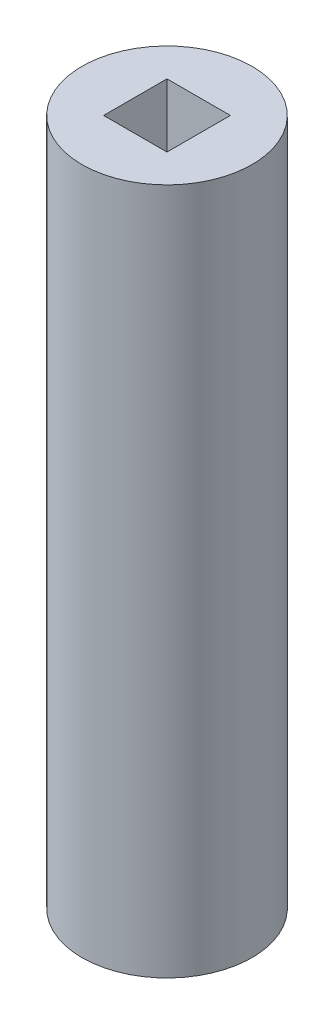
ISO-10303-21;
HEADER;
FILE_DESCRIPTION(('STEP AP214'),'2;1');
FILE_NAME('part.step','',(''),(''),'','','');
FILE_SCHEMA(('AUTOMOTIVE_DESIGN { 1 0 10303 214 1 1 1 1 }'));
ENDSEC;
DATA;
#1=APPLICATION_CONTEXT('core data for automotive mechanical design processes');
#2=APPLICATION_PROTOCOL_DEFINITION('international standard','automotive_design',2000,#1);
#3=PRODUCT_CONTEXT('',#1,'mechanical');
#4=PRODUCT('Part','Part','',(#3));
#5=PRODUCT_RELATED_PRODUCT_CATEGORY('part','',(#4));
#6=PRODUCT_DEFINITION_FORMATION('','',#4);
#7=PRODUCT_DEFINITION_CONTEXT('part definition',#1,'design');
#8=PRODUCT_DEFINITION('design','',#6,#7);
#9=PRODUCT_DEFINITION_SHAPE('','',#8);
#10=(LENGTH_UNIT() NAMED_UNIT(*) SI_UNIT(.MILLI.,.METRE.));
#11=(NAMED_UNIT(*) PLANE_ANGLE_UNIT() SI_UNIT($,.RADIAN.));
#12=(NAMED_UNIT(*) SI_UNIT($,.STERADIAN.) SOLID_ANGLE_UNIT());
#13=UNCERTAINTY_MEASURE_WITH_UNIT(LENGTH_MEASURE(1.E-05),#10,'distance_accuracy_value','');
#14=(GEOMETRIC_REPRESENTATION_CONTEXT(3) GLOBAL_UNCERTAINTY_ASSIGNED_CONTEXT((#13)) GLOBAL_UNIT_ASSIGNED_CONTEXT((#10,
#11,#12)) REPRESENTATION_CONTEXT('',''));
#15=CARTESIAN_POINT('',(0.,0.,0.));
#16=DIRECTION('',(0.,0.,1.));
#17=DIRECTION('',(1.,0.,0.));
#18=AXIS2_PLACEMENT_3D('',#15,#16,#17);
#19=CARTESIAN_POINT('',(0.,406.4,0.));
#20=DIRECTION('',(0.,1.,0.));
#21=DIRECTION('',(0.,0.,1.));
#22=AXIS2_PLACEMENT_3D('',#19,#20,#21);
#23=PLANE('',#22);
#24=CARTESIAN_POINT('',(0.,406.4,0.));
#25=DIRECTION('',(0.,1.,0.));
#26=DIRECTION('',(0.,0.,1.));
#27=AXIS2_PLACEMENT_3D('',#24,#25,#26);
#28=CIRCLE('',#27,51.1302);
#29=CARTESIAN_POINT('',(0.,406.4,51.1302));
#30=VERTEX_POINT('',#29);
#31=EDGE_CURVE('E11',#30,#30,#28,.T.);
#32=ORIENTED_EDGE('',*,*,#31,.T.);
#33=EDGE_LOOP('',(#32));
#34=FACE_BOUND('',#33,.T.);
#35=DIRECTION('',(-1.,0.,0.));
#36=VECTOR('',#35,1.);
#37=CARTESIAN_POINT('',(-19.05,406.4,-19.05));
#38=LINE('',#37,#36);
#39=CARTESIAN_POINT('',(19.05,406.4,-19.05));
#40=VERTEX_POINT('',#39);
#41=CARTESIAN_POINT('',(-19.05,406.4,-19.05));
#42=VERTEX_POINT('',#41);
#43=EDGE_CURVE('E101',#40,#42,#38,.T.);
#44=ORIENTED_EDGE('',*,*,#43,.F.);
#45=DIRECTION('',(0.,0.,-1.));
#46=VECTOR('',#45,1.);
#47=CARTESIAN_POINT('',(19.05,406.4,19.05));
#48=LINE('',#47,#46);
#49=CARTESIAN_POINT('',(19.05,406.4,19.05));
#50=VERTEX_POINT('',#49);
#51=EDGE_CURVE('E80',#50,#40,#48,.T.);
#52=ORIENTED_EDGE('',*,*,#51,.F.);
#53=DIRECTION('',(1.,0.,0.));
#54=VECTOR('',#53,1.);
#55=CARTESIAN_POINT('',(-19.05,406.4,19.05));
#56=LINE('',#55,#54);
#57=CARTESIAN_POINT('',(-19.05,406.4,19.05));
#58=VERTEX_POINT('',#57);
#59=EDGE_CURVE('E60',#58,#50,#56,.T.);
#60=ORIENTED_EDGE('',*,*,#59,.F.);
#61=DIRECTION('',(0.,0.,1.));
#62=VECTOR('',#61,1.);
#63=CARTESIAN_POINT('',(-19.05,406.4,19.05));
#64=LINE('',#63,#62);
#65=EDGE_CURVE('E116',#42,#58,#64,.T.);
#66=ORIENTED_EDGE('',*,*,#65,.F.);
#67=EDGE_LOOP('',(#44,#52,#60,#66));
#68=FACE_BOUND('',#67,.T.);
#69=ADVANCED_FACE('F39',(#34,#68),#23,.T.);
#70=CARTESIAN_POINT('',(0.,406.4,0.));
#71=DIRECTION('',(0.,-1.,0.));
#72=DIRECTION('',(0.,0.,-1.));
#73=AXIS2_PLACEMENT_3D('',#70,#71,#72);
#74=CYLINDRICAL_SURFACE('',#73,51.1302);
#75=ORIENTED_EDGE('',*,*,#31,.F.);
#76=EDGE_LOOP('',(#75));
#77=FACE_BOUND('',#76,.T.);
#78=CARTESIAN_POINT('',(0.,-6.35,0.));
#79=DIRECTION('',(0.,-1.,0.));
#80=DIRECTION('',(0.,0.,-1.));
#81=AXIS2_PLACEMENT_3D('',#78,#79,#80);
#82=CIRCLE('',#81,51.1302);
#83=CARTESIAN_POINT('',(0.,-6.35,-51.1302));
#84=VERTEX_POINT('',#83);
#85=EDGE_CURVE('E96',#84,#84,#82,.T.);
#86=ORIENTED_EDGE('',*,*,#85,.F.);
#87=EDGE_LOOP('',(#86));
#88=FACE_BOUND('',#87,.T.);
#89=ADVANCED_FACE('F41',(#77,#88),#74,.T.);
#90=CARTESIAN_POINT('',(19.05,406.4,19.05));
#91=DIRECTION('',(-1.,0.,0.));
#92=DIRECTION('',(0.,0.,1.));
#93=AXIS2_PLACEMENT_3D('',#90,#91,#92);
#94=PLANE('',#93);
#95=DIRECTION('',(0.,0.,-1.));
#96=VECTOR('',#95,1.);
#97=CARTESIAN_POINT('',(19.05,0.,19.05));
#98=LINE('',#97,#96);
#99=CARTESIAN_POINT('',(19.05,0.,19.05));
#100=VERTEX_POINT('',#99);
#101=CARTESIAN_POINT('',(19.05,0.,-19.05));
#102=VERTEX_POINT('',#101);
#103=EDGE_CURVE('E91',#100,#102,#98,.T.);
#104=ORIENTED_EDGE('',*,*,#103,.F.);
#105=DIRECTION('',(0.,-1.,0.));
#106=VECTOR('',#105,1.);
#107=CARTESIAN_POINT('',(19.05,406.4,19.05));
#108=LINE('',#107,#106);
#109=EDGE_CURVE('E83',#50,#100,#108,.T.);
#110=ORIENTED_EDGE('',*,*,#109,.F.);
#111=ORIENTED_EDGE('',*,*,#51,.T.);
#112=DIRECTION('',(0.,-1.,0.));
#113=VECTOR('',#112,1.);
#114=CARTESIAN_POINT('',(19.05,406.4,-19.05));
#115=LINE('',#114,#113);
#116=EDGE_CURVE('E47',#40,#102,#115,.T.);
#117=ORIENTED_EDGE('',*,*,#116,.T.);
#118=EDGE_LOOP('',(#104,#110,#111,#117));
#119=FACE_BOUND('',#118,.T.);
#120=ADVANCED_FACE('F92',(#119),#94,.T.);
#121=CARTESIAN_POINT('',(-19.05,406.4,-19.05));
#122=DIRECTION('',(0.,0.,1.));
#123=DIRECTION('',(1.,0.,0.));
#124=AXIS2_PLACEMENT_3D('',#121,#122,#123);
#125=PLANE('',#124);
#126=DIRECTION('',(-1.,0.,0.));
#127=VECTOR('',#126,1.);
#128=CARTESIAN_POINT('',(-19.05,0.,-19.05));
#129=LINE('',#128,#127);
#130=CARTESIAN_POINT('',(-19.05,0.,-19.05));
#131=VERTEX_POINT('',#130);
#132=EDGE_CURVE('E95',#102,#131,#129,.T.);
#133=ORIENTED_EDGE('',*,*,#132,.F.);
#134=ORIENTED_EDGE('',*,*,#116,.F.);
#135=ORIENTED_EDGE('',*,*,#43,.T.);
#136=DIRECTION('',(0.,-1.,0.));
#137=VECTOR('',#136,1.);
#138=CARTESIAN_POINT('',(-19.05,406.4,-19.05));
#139=LINE('',#138,#137);
#140=EDGE_CURVE('E107',#42,#131,#139,.T.);
#141=ORIENTED_EDGE('',*,*,#140,.T.);
#142=EDGE_LOOP('',(#133,#134,#135,#141));
#143=FACE_BOUND('',#142,.T.);
#144=ADVANCED_FACE('F110',(#143),#125,.T.);
#145=CARTESIAN_POINT('',(-19.05,406.4,19.05));
#146=DIRECTION('',(1.,0.,0.));
#147=DIRECTION('',(0.,0.,-1.));
#148=AXIS2_PLACEMENT_3D('',#145,#146,#147);
#149=PLANE('',#148);
#150=DIRECTION('',(0.,0.,1.));
#151=VECTOR('',#150,1.);
#152=CARTESIAN_POINT('',(-19.05,0.,19.05));
#153=LINE('',#152,#151);
#154=CARTESIAN_POINT('',(-19.05,0.,19.05));
#155=VERTEX_POINT('',#154);
#156=EDGE_CURVE('E99',#131,#155,#153,.T.);
#157=ORIENTED_EDGE('',*,*,#156,.F.);
#158=ORIENTED_EDGE('',*,*,#140,.F.);
#159=ORIENTED_EDGE('',*,*,#65,.T.);
#160=DIRECTION('',(0.,-1.,0.));
#161=VECTOR('',#160,1.);
#162=CARTESIAN_POINT('',(-19.05,406.4,19.05));
#163=LINE('',#162,#161);
#164=EDGE_CURVE('E54',#58,#155,#163,.T.);
#165=ORIENTED_EDGE('',*,*,#164,.T.);
#166=EDGE_LOOP('',(#157,#158,#159,#165));
#167=FACE_BOUND('',#166,.T.);
#168=ADVANCED_FACE('F113',(#167),#149,.T.);
#169=CARTESIAN_POINT('',(-19.05,406.4,19.05));
#170=DIRECTION('',(0.,0.,-1.));
#171=DIRECTION('',(-1.,0.,0.));
#172=AXIS2_PLACEMENT_3D('',#169,#170,#171);
#173=PLANE('',#172);
#174=DIRECTION('',(1.,0.,0.));
#175=VECTOR('',#174,1.);
#176=CARTESIAN_POINT('',(-19.05,0.,19.05));
#177=LINE('',#176,#175);
#178=EDGE_CURVE('E87',#155,#100,#177,.T.);
#179=ORIENTED_EDGE('',*,*,#178,.F.);
#180=ORIENTED_EDGE('',*,*,#164,.F.);
#181=ORIENTED_EDGE('',*,*,#59,.T.);
#182=ORIENTED_EDGE('',*,*,#109,.T.);
#183=EDGE_LOOP('',(#179,#180,#181,#182));
#184=FACE_BOUND('',#183,.T.);
#185=ADVANCED_FACE('F85',(#184),#173,.T.);
#186=CARTESIAN_POINT('',(0.,0.,0.));
#187=DIRECTION('',(0.,-1.,0.));
#188=DIRECTION('',(0.,0.,-1.));
#189=AXIS2_PLACEMENT_3D('',#186,#187,#188);
#190=PLANE('',#189);
#191=ORIENTED_EDGE('',*,*,#178,.T.);
#192=ORIENTED_EDGE('',*,*,#103,.T.);
#193=ORIENTED_EDGE('',*,*,#132,.T.);
#194=ORIENTED_EDGE('',*,*,#156,.T.);
#195=EDGE_LOOP('',(#191,#192,#193,#194));
#196=FACE_BOUND('',#195,.T.);
#197=ADVANCED_FACE('F98',(#196),#190,.F.);
#198=CARTESIAN_POINT('',(0.,-6.35,0.));
#199=DIRECTION('',(0.,-1.,0.));
#200=DIRECTION('',(0.,0.,-1.));
#201=AXIS2_PLACEMENT_3D('',#198,#199,#200);
#202=PLANE('',#201);
#203=ORIENTED_EDGE('',*,*,#85,.T.);
#204=EDGE_LOOP('',(#203));
#205=FACE_BOUND('',#204,.T.);
#206=ADVANCED_FACE('F122',(#205),#202,.T.);
#207=CLOSED_SHELL('',(#69,#89,#120,#144,#168,#185,#197,#206));
#208=MANIFOLD_SOLID_BREP('B2',#207);
#209=ADVANCED_BREP_SHAPE_REPRESENTATION('',(#18,#208),#14);
#210=SHAPE_DEFINITION_REPRESENTATION(#9,#209);
ENDSEC;
END-ISO-10303-21;
